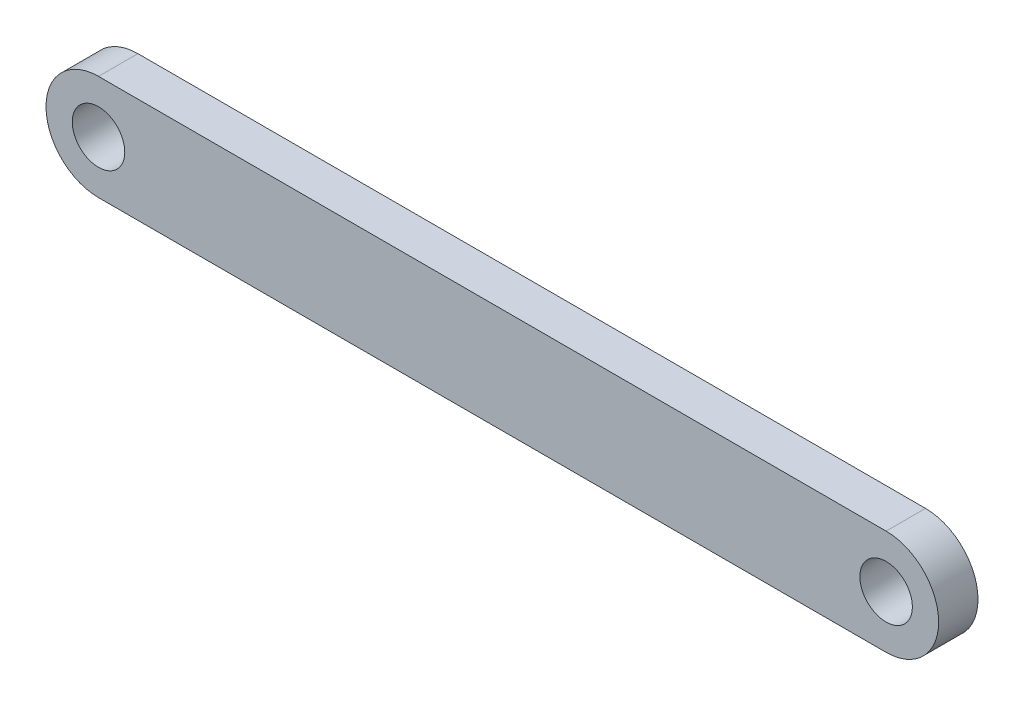
ISO-10303-21;
HEADER;
FILE_DESCRIPTION(('STEP AP214'),'2;1');
FILE_NAME('part.step','',(''),(''),'','','');
FILE_SCHEMA(('AUTOMOTIVE_DESIGN { 1 0 10303 214 1 1 1 1 }'));
ENDSEC;
DATA;
#1=APPLICATION_CONTEXT('core data for automotive mechanical design processes');
#2=APPLICATION_PROTOCOL_DEFINITION('international standard','automotive_design',2000,#1);
#3=PRODUCT_CONTEXT('',#1,'mechanical');
#4=PRODUCT('Part','Part','',(#3));
#5=PRODUCT_RELATED_PRODUCT_CATEGORY('part','',(#4));
#6=PRODUCT_DEFINITION_FORMATION('','',#4);
#7=PRODUCT_DEFINITION_CONTEXT('part definition',#1,'design');
#8=PRODUCT_DEFINITION('design','',#6,#7);
#9=PRODUCT_DEFINITION_SHAPE('','',#8);
#10=(LENGTH_UNIT() NAMED_UNIT(*) SI_UNIT(.MILLI.,.METRE.));
#11=(NAMED_UNIT(*) PLANE_ANGLE_UNIT() SI_UNIT($,.RADIAN.));
#12=(NAMED_UNIT(*) SI_UNIT($,.STERADIAN.) SOLID_ANGLE_UNIT());
#13=UNCERTAINTY_MEASURE_WITH_UNIT(LENGTH_MEASURE(1.E-05),#10,'distance_accuracy_value','');
#14=(GEOMETRIC_REPRESENTATION_CONTEXT(3) GLOBAL_UNCERTAINTY_ASSIGNED_CONTEXT((#13)) GLOBAL_UNIT_ASSIGNED_CONTEXT((#10,
#11,#12)) REPRESENTATION_CONTEXT('',''));
#15=CARTESIAN_POINT('',(0.,0.,0.));
#16=DIRECTION('',(0.,0.,1.));
#17=DIRECTION('',(1.,0.,0.));
#18=AXIS2_PLACEMENT_3D('',#15,#16,#17);
#19=CARTESIAN_POINT('',(0.,0.,1.5));
#20=DIRECTION('',(0.,0.,1.));
#21=DIRECTION('',(1.,0.,0.));
#22=AXIS2_PLACEMENT_3D('',#19,#20,#21);
#23=PLANE('',#22);
#24=CARTESIAN_POINT('',(30.,0.,1.5));
#25=DIRECTION('',(0.,0.,1.));
#26=DIRECTION('',(1.,0.,0.));
#27=AXIS2_PLACEMENT_3D('',#24,#25,#26);
#28=CIRCLE('',#27,0.999999999999998);
#29=CARTESIAN_POINT('',(31.,0.,1.5));
#30=VERTEX_POINT('',#29);
#31=EDGE_CURVE('E102',#30,#30,#28,.T.);
#32=ORIENTED_EDGE('',*,*,#31,.F.);
#33=EDGE_LOOP('',(#32));
#34=FACE_BOUND('',#33,.T.);
#35=CARTESIAN_POINT('',(0.,0.,1.5));
#36=DIRECTION('',(0.,0.,1.));
#37=DIRECTION('',(1.,0.,0.));
#38=AXIS2_PLACEMENT_3D('',#35,#36,#37);
#39=CIRCLE('',#38,2.);
#40=CARTESIAN_POINT('',(0.,2.,1.5));
#41=VERTEX_POINT('',#40);
#42=CARTESIAN_POINT('',(0.,-2.,1.5));
#43=VERTEX_POINT('',#42);
#44=EDGE_CURVE('E87',#41,#43,#39,.T.);
#45=ORIENTED_EDGE('',*,*,#44,.T.);
#46=DIRECTION('',(1.,0.,0.));
#47=VECTOR('',#46,1.);
#48=CARTESIAN_POINT('',(0.,-2.,1.5));
#49=LINE('',#48,#47);
#50=CARTESIAN_POINT('',(30.,-2.,1.5));
#51=VERTEX_POINT('',#50);
#52=EDGE_CURVE('E82',#43,#51,#49,.T.);
#53=ORIENTED_EDGE('',*,*,#52,.T.);
#54=CARTESIAN_POINT('',(30.,0.,1.5));
#55=DIRECTION('',(0.,0.,1.));
#56=DIRECTION('',(1.,0.,0.));
#57=AXIS2_PLACEMENT_3D('',#54,#55,#56);
#58=CIRCLE('',#57,2.);
#59=CARTESIAN_POINT('',(30.,2.,1.5));
#60=VERTEX_POINT('',#59);
#61=EDGE_CURVE('E85',#51,#60,#58,.T.);
#62=ORIENTED_EDGE('',*,*,#61,.T.);
#63=DIRECTION('',(-1.,0.,0.));
#64=VECTOR('',#63,1.);
#65=CARTESIAN_POINT('',(0.,2.,1.5));
#66=LINE('',#65,#64);
#67=EDGE_CURVE('E52',#60,#41,#66,.T.);
#68=ORIENTED_EDGE('',*,*,#67,.T.);
#69=EDGE_LOOP('',(#45,#53,#62,#68));
#70=FACE_BOUND('',#69,.T.);
#71=CARTESIAN_POINT('',(0.,0.,1.5));
#72=DIRECTION('',(0.,0.,1.));
#73=DIRECTION('',(1.,0.,0.));
#74=AXIS2_PLACEMENT_3D('',#71,#72,#73);
#75=CIRCLE('',#74,1.);
#76=CARTESIAN_POINT('',(1.,0.,1.5));
#77=VERTEX_POINT('',#76);
#78=EDGE_CURVE('E117',#77,#77,#75,.T.);
#79=ORIENTED_EDGE('',*,*,#78,.F.);
#80=EDGE_LOOP('',(#79));
#81=FACE_BOUND('',#80,.T.);
#82=ADVANCED_FACE('F35',(#34,#70,#81),#23,.T.);
#83=CARTESIAN_POINT('',(0.,0.,0.));
#84=DIRECTION('',(0.,0.,1.));
#85=DIRECTION('',(1.,0.,0.));
#86=AXIS2_PLACEMENT_3D('',#83,#84,#85);
#87=PLANE('',#86);
#88=CARTESIAN_POINT('',(0.,0.,0.));
#89=DIRECTION('',(0.,0.,1.));
#90=DIRECTION('',(1.,0.,0.));
#91=AXIS2_PLACEMENT_3D('',#88,#89,#90);
#92=CIRCLE('',#91,2.);
#93=CARTESIAN_POINT('',(0.,2.,0.));
#94=VERTEX_POINT('',#93);
#95=CARTESIAN_POINT('',(0.,-2.,0.));
#96=VERTEX_POINT('',#95);
#97=EDGE_CURVE('E99',#94,#96,#92,.T.);
#98=ORIENTED_EDGE('',*,*,#97,.F.);
#99=DIRECTION('',(-1.,0.,0.));
#100=VECTOR('',#99,1.);
#101=CARTESIAN_POINT('',(0.,2.,0.));
#102=LINE('',#101,#100);
#103=CARTESIAN_POINT('',(30.,2.,0.));
#104=VERTEX_POINT('',#103);
#105=EDGE_CURVE('E75',#104,#94,#102,.T.);
#106=ORIENTED_EDGE('',*,*,#105,.F.);
#107=CARTESIAN_POINT('',(30.,0.,0.));
#108=DIRECTION('',(0.,0.,1.));
#109=DIRECTION('',(1.,0.,0.));
#110=AXIS2_PLACEMENT_3D('',#107,#108,#109);
#111=CIRCLE('',#110,2.);
#112=CARTESIAN_POINT('',(30.,-2.,0.));
#113=VERTEX_POINT('',#112);
#114=EDGE_CURVE('E69',#113,#104,#111,.T.);
#115=ORIENTED_EDGE('',*,*,#114,.F.);
#116=DIRECTION('',(1.,0.,0.));
#117=VECTOR('',#116,1.);
#118=CARTESIAN_POINT('',(0.,-2.,0.));
#119=LINE('',#118,#117);
#120=EDGE_CURVE('E91',#96,#113,#119,.T.);
#121=ORIENTED_EDGE('',*,*,#120,.F.);
#122=EDGE_LOOP('',(#98,#106,#115,#121));
#123=FACE_BOUND('',#122,.T.);
#124=CARTESIAN_POINT('',(30.,0.,0.));
#125=DIRECTION('',(0.,0.,1.));
#126=DIRECTION('',(1.,0.,0.));
#127=AXIS2_PLACEMENT_3D('',#124,#125,#126);
#128=CIRCLE('',#127,0.999999999999998);
#129=CARTESIAN_POINT('',(31.,0.,0.));
#130=VERTEX_POINT('',#129);
#131=EDGE_CURVE('E114',#130,#130,#128,.T.);
#132=ORIENTED_EDGE('',*,*,#131,.T.);
#133=EDGE_LOOP('',(#132));
#134=FACE_BOUND('',#133,.T.);
#135=CARTESIAN_POINT('',(0.,0.,0.));
#136=DIRECTION('',(0.,0.,1.));
#137=DIRECTION('',(1.,0.,0.));
#138=AXIS2_PLACEMENT_3D('',#135,#136,#137);
#139=CIRCLE('',#138,1.);
#140=CARTESIAN_POINT('',(1.,0.,0.));
#141=VERTEX_POINT('',#140);
#142=EDGE_CURVE('E120',#141,#141,#139,.T.);
#143=ORIENTED_EDGE('',*,*,#142,.T.);
#144=EDGE_LOOP('',(#143));
#145=FACE_BOUND('',#144,.T.);
#146=ADVANCED_FACE('F110',(#123,#134,#145),#87,.F.);
#147=CARTESIAN_POINT('',(0.,0.,1.5));
#148=DIRECTION('',(0.,0.,-1.));
#149=DIRECTION('',(-1.,0.,0.));
#150=AXIS2_PLACEMENT_3D('',#147,#148,#149);
#151=CYLINDRICAL_SURFACE('',#150,2.);
#152=ORIENTED_EDGE('',*,*,#97,.T.);
#153=DIRECTION('',(0.,0.,-1.));
#154=VECTOR('',#153,1.);
#155=CARTESIAN_POINT('',(0.,-2.,1.5));
#156=LINE('',#155,#154);
#157=EDGE_CURVE('E11',#43,#96,#156,.T.);
#158=ORIENTED_EDGE('',*,*,#157,.F.);
#159=ORIENTED_EDGE('',*,*,#44,.F.);
#160=DIRECTION('',(0.,0.,-1.));
#161=VECTOR('',#160,1.);
#162=CARTESIAN_POINT('',(0.,2.,1.5));
#163=LINE('',#162,#161);
#164=EDGE_CURVE('E95',#41,#94,#163,.T.);
#165=ORIENTED_EDGE('',*,*,#164,.T.);
#166=EDGE_LOOP('',(#152,#158,#159,#165));
#167=FACE_BOUND('',#166,.T.);
#168=ADVANCED_FACE('F37',(#167),#151,.T.);
#169=CARTESIAN_POINT('',(0.,-2.,1.5));
#170=DIRECTION('',(0.,1.,0.));
#171=DIRECTION('',(0.,0.,1.));
#172=AXIS2_PLACEMENT_3D('',#169,#170,#171);
#173=PLANE('',#172);
#174=ORIENTED_EDGE('',*,*,#120,.T.);
#175=DIRECTION('',(0.,0.,-1.));
#176=VECTOR('',#175,1.);
#177=CARTESIAN_POINT('',(30.,-2.,1.5));
#178=LINE('',#177,#176);
#179=EDGE_CURVE('E44',#51,#113,#178,.T.);
#180=ORIENTED_EDGE('',*,*,#179,.F.);
#181=ORIENTED_EDGE('',*,*,#52,.F.);
#182=ORIENTED_EDGE('',*,*,#157,.T.);
#183=EDGE_LOOP('',(#174,#180,#181,#182));
#184=FACE_BOUND('',#183,.T.);
#185=ADVANCED_FACE('F90',(#184),#173,.F.);
#186=CARTESIAN_POINT('',(30.,0.,1.5));
#187=DIRECTION('',(0.,0.,-1.));
#188=DIRECTION('',(-1.,0.,0.));
#189=AXIS2_PLACEMENT_3D('',#186,#187,#188);
#190=CYLINDRICAL_SURFACE('',#189,2.);
#191=ORIENTED_EDGE('',*,*,#114,.T.);
#192=DIRECTION('',(0.,0.,-1.));
#193=VECTOR('',#192,1.);
#194=CARTESIAN_POINT('',(30.,2.,1.5));
#195=LINE('',#194,#193);
#196=EDGE_CURVE('E92',#60,#104,#195,.T.);
#197=ORIENTED_EDGE('',*,*,#196,.F.);
#198=ORIENTED_EDGE('',*,*,#61,.F.);
#199=ORIENTED_EDGE('',*,*,#179,.T.);
#200=EDGE_LOOP('',(#191,#197,#198,#199));
#201=FACE_BOUND('',#200,.T.);
#202=ADVANCED_FACE('F93',(#201),#190,.T.);
#203=CARTESIAN_POINT('',(0.,2.,1.5));
#204=DIRECTION('',(0.,-1.,0.));
#205=DIRECTION('',(0.,0.,-1.));
#206=AXIS2_PLACEMENT_3D('',#203,#204,#205);
#207=PLANE('',#206);
#208=ORIENTED_EDGE('',*,*,#105,.T.);
#209=ORIENTED_EDGE('',*,*,#164,.F.);
#210=ORIENTED_EDGE('',*,*,#67,.F.);
#211=ORIENTED_EDGE('',*,*,#196,.T.);
#212=EDGE_LOOP('',(#208,#209,#210,#211));
#213=FACE_BOUND('',#212,.T.);
#214=ADVANCED_FACE('F107',(#213),#207,.F.);
#215=CARTESIAN_POINT('',(30.,0.,1.5));
#216=DIRECTION('',(0.,0.,-1.));
#217=DIRECTION('',(-1.,0.,0.));
#218=AXIS2_PLACEMENT_3D('',#215,#216,#217);
#219=CYLINDRICAL_SURFACE('',#218,0.999999999999998);
#220=ORIENTED_EDGE('',*,*,#31,.T.);
#221=EDGE_LOOP('',(#220));
#222=FACE_BOUND('',#221,.T.);
#223=ORIENTED_EDGE('',*,*,#131,.F.);
#224=EDGE_LOOP('',(#223));
#225=FACE_BOUND('',#224,.T.);
#226=ADVANCED_FACE('F137',(#222,#225),#219,.F.);
#227=CARTESIAN_POINT('',(0.,0.,1.5));
#228=DIRECTION('',(0.,0.,-1.));
#229=DIRECTION('',(-1.,0.,0.));
#230=AXIS2_PLACEMENT_3D('',#227,#228,#229);
#231=CYLINDRICAL_SURFACE('',#230,1.);
#232=ORIENTED_EDGE('',*,*,#78,.T.);
#233=EDGE_LOOP('',(#232));
#234=FACE_BOUND('',#233,.T.);
#235=ORIENTED_EDGE('',*,*,#142,.F.);
#236=EDGE_LOOP('',(#235));
#237=FACE_BOUND('',#236,.T.);
#238=ADVANCED_FACE('F126',(#234,#237),#231,.F.);
#239=CLOSED_SHELL('',(#82,#146,#168,#185,#202,#214,#226,#238));
#240=MANIFOLD_SOLID_BREP('B2',#239);
#241=ADVANCED_BREP_SHAPE_REPRESENTATION('',(#18,#240),#14);
#242=SHAPE_DEFINITION_REPRESENTATION(#9,#241);
ENDSEC;
END-ISO-10303-21;
